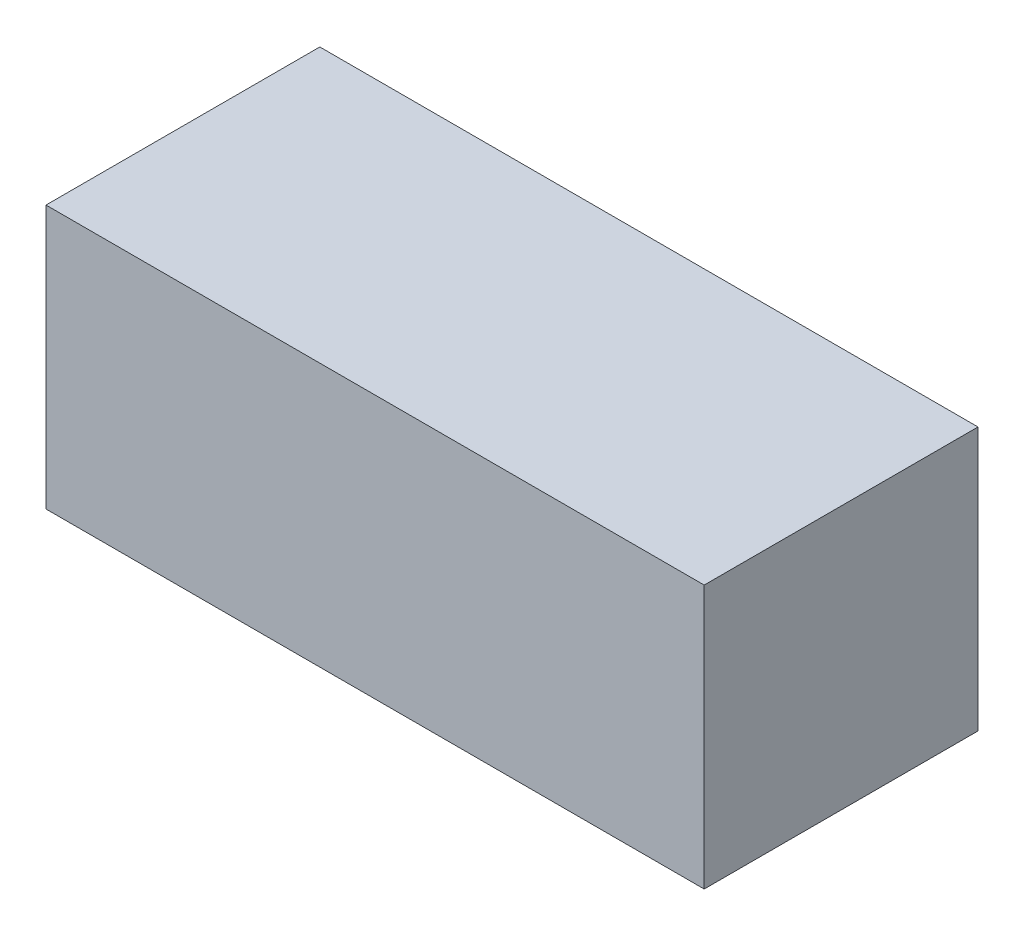
ISO-10303-21;
HEADER;
FILE_DESCRIPTION(('STEP AP214'),'2;1');
FILE_NAME('part.step','',(''),(''),'','','');
FILE_SCHEMA(('AUTOMOTIVE_DESIGN { 1 0 10303 214 1 1 1 1 }'));
ENDSEC;
DATA;
#1=APPLICATION_CONTEXT('core data for automotive mechanical design processes');
#2=APPLICATION_PROTOCOL_DEFINITION('international standard','automotive_design',2000,#1);
#3=PRODUCT_CONTEXT('',#1,'mechanical');
#4=PRODUCT('Part','Part','',(#3));
#5=PRODUCT_RELATED_PRODUCT_CATEGORY('part','',(#4));
#6=PRODUCT_DEFINITION_FORMATION('','',#4);
#7=PRODUCT_DEFINITION_CONTEXT('part definition',#1,'design');
#8=PRODUCT_DEFINITION('design','',#6,#7);
#9=PRODUCT_DEFINITION_SHAPE('','',#8);
#10=(LENGTH_UNIT() NAMED_UNIT(*) SI_UNIT(.MILLI.,.METRE.));
#11=(NAMED_UNIT(*) PLANE_ANGLE_UNIT() SI_UNIT($,.RADIAN.));
#12=(NAMED_UNIT(*) SI_UNIT($,.STERADIAN.) SOLID_ANGLE_UNIT());
#13=UNCERTAINTY_MEASURE_WITH_UNIT(LENGTH_MEASURE(1.E-05),#10,'distance_accuracy_value','');
#14=(GEOMETRIC_REPRESENTATION_CONTEXT(3) GLOBAL_UNCERTAINTY_ASSIGNED_CONTEXT((#13)) GLOBAL_UNIT_ASSIGNED_CONTEXT((#10,
#11,#12)) REPRESENTATION_CONTEXT('',''));
#15=CARTESIAN_POINT('',(0.,0.,0.));
#16=DIRECTION('',(0.,0.,1.));
#17=DIRECTION('',(1.,0.,0.));
#18=AXIS2_PLACEMENT_3D('',#15,#16,#17);
#19=CARTESIAN_POINT('',(0.,0.,-400.));
#20=DIRECTION('',(-1.,0.,0.));
#21=DIRECTION('',(0.,0.,1.));
#22=AXIS2_PLACEMENT_3D('',#19,#20,#21);
#23=PLANE('',#22);
#24=DIRECTION('',(0.,0.,1.));
#25=VECTOR('',#24,1.);
#26=CARTESIAN_POINT('',(0.,0.,-400.));
#27=LINE('',#26,#25);
#28=CARTESIAN_POINT('',(0.,0.,-400.));
#29=VERTEX_POINT('',#28);
#30=CARTESIAN_POINT('',(0.,0.,16.));
#31=VERTEX_POINT('',#30);
#32=EDGE_CURVE('E11',#29,#31,#27,.T.);
#33=ORIENTED_EDGE('',*,*,#32,.T.);
#34=DIRECTION('',(0.,-1.,0.));
#35=VECTOR('',#34,1.);
#36=CARTESIAN_POINT('',(0.,400.,16.));
#37=LINE('',#36,#35);
#38=CARTESIAN_POINT('',(0.,400.,16.));
#39=VERTEX_POINT('',#38);
#40=EDGE_CURVE('E149',#39,#31,#37,.T.);
#41=ORIENTED_EDGE('',*,*,#40,.F.);
#42=DIRECTION('',(0.,0.,1.));
#43=VECTOR('',#42,1.);
#44=CARTESIAN_POINT('',(0.,400.,-400.));
#45=LINE('',#44,#43);
#46=CARTESIAN_POINT('',(0.,400.,-400.));
#47=VERTEX_POINT('',#46);
#48=EDGE_CURVE('E43',#47,#39,#45,.T.);
#49=ORIENTED_EDGE('',*,*,#48,.F.);
#50=DIRECTION('',(0.,-1.,0.));
#51=VECTOR('',#50,1.);
#52=CARTESIAN_POINT('',(0.,0.,-400.));
#53=LINE('',#52,#51);
#54=EDGE_CURVE('E117',#47,#29,#53,.T.);
#55=ORIENTED_EDGE('',*,*,#54,.T.);
#56=EDGE_LOOP('',(#33,#41,#49,#55));
#57=FACE_BOUND('',#56,.T.);
#58=ADVANCED_FACE('F33',(#57),#23,.T.);
#59=CARTESIAN_POINT('',(0.,400.,-400.));
#60=DIRECTION('',(0.,1.,0.));
#61=DIRECTION('',(0.,0.,1.));
#62=AXIS2_PLACEMENT_3D('',#59,#60,#61);
#63=PLANE('',#62);
#64=ORIENTED_EDGE('',*,*,#48,.T.);
#65=DIRECTION('',(-1.,0.,0.));
#66=VECTOR('',#65,1.);
#67=CARTESIAN_POINT('',(0.,400.,16.));
#68=LINE('',#67,#66);
#69=CARTESIAN_POINT('',(1000.,400.,16.));
#70=VERTEX_POINT('',#69);
#71=EDGE_CURVE('E103',#70,#39,#68,.T.);
#72=ORIENTED_EDGE('',*,*,#71,.F.);
#73=DIRECTION('',(0.,0.,1.));
#74=VECTOR('',#73,1.);
#75=CARTESIAN_POINT('',(1000.,400.,-400.));
#76=LINE('',#75,#74);
#77=CARTESIAN_POINT('',(1000.,400.,-400.));
#78=VERTEX_POINT('',#77);
#79=EDGE_CURVE('E95',#78,#70,#76,.T.);
#80=ORIENTED_EDGE('',*,*,#79,.F.);
#81=DIRECTION('',(-1.,0.,0.));
#82=VECTOR('',#81,1.);
#83=CARTESIAN_POINT('',(0.,400.,-400.));
#84=LINE('',#83,#82);
#85=EDGE_CURVE('E99',#78,#47,#84,.T.);
#86=ORIENTED_EDGE('',*,*,#85,.T.);
#87=EDGE_LOOP('',(#64,#72,#80,#86));
#88=FACE_BOUND('',#87,.T.);
#89=ADVANCED_FACE('F98',(#88),#63,.T.);
#90=CARTESIAN_POINT('',(1000.,400.,-400.));
#91=DIRECTION('',(1.,0.,0.));
#92=DIRECTION('',(0.,0.,-1.));
#93=AXIS2_PLACEMENT_3D('',#90,#91,#92);
#94=PLANE('',#93);
#95=ORIENTED_EDGE('',*,*,#79,.T.);
#96=DIRECTION('',(0.,1.,0.));
#97=VECTOR('',#96,1.);
#98=CARTESIAN_POINT('',(1000.,400.,16.));
#99=LINE('',#98,#97);
#100=CARTESIAN_POINT('',(1000.,0.,16.));
#101=VERTEX_POINT('',#100);
#102=EDGE_CURVE('E236',#101,#70,#99,.T.);
#103=ORIENTED_EDGE('',*,*,#102,.F.);
#104=DIRECTION('',(0.,0.,1.));
#105=VECTOR('',#104,1.);
#106=CARTESIAN_POINT('',(1000.,0.,-400.));
#107=LINE('',#106,#105);
#108=CARTESIAN_POINT('',(1000.,0.,-400.));
#109=VERTEX_POINT('',#108);
#110=EDGE_CURVE('E108',#109,#101,#107,.T.);
#111=ORIENTED_EDGE('',*,*,#110,.F.);
#112=DIRECTION('',(0.,1.,0.));
#113=VECTOR('',#112,1.);
#114=CARTESIAN_POINT('',(1000.,400.,-400.));
#115=LINE('',#114,#113);
#116=EDGE_CURVE('E114',#109,#78,#115,.T.);
#117=ORIENTED_EDGE('',*,*,#116,.T.);
#118=EDGE_LOOP('',(#95,#103,#111,#117));
#119=FACE_BOUND('',#118,.T.);
#120=ADVANCED_FACE('F119',(#119),#94,.T.);
#121=CARTESIAN_POINT('',(1000.,0.,-400.));
#122=DIRECTION('',(0.,-1.,0.));
#123=DIRECTION('',(1.,0.,0.));
#124=AXIS2_PLACEMENT_3D('',#121,#122,#123);
#125=PLANE('',#124);
#126=ORIENTED_EDGE('',*,*,#110,.T.);
#127=DIRECTION('',(1.,0.,0.));
#128=VECTOR('',#127,1.);
#129=CARTESIAN_POINT('',(0.,0.,16.));
#130=LINE('',#129,#128);
#131=EDGE_CURVE('E152',#31,#101,#130,.T.);
#132=ORIENTED_EDGE('',*,*,#131,.F.);
#133=ORIENTED_EDGE('',*,*,#32,.F.);
#134=DIRECTION('',(1.,0.,0.));
#135=VECTOR('',#134,1.);
#136=CARTESIAN_POINT('',(0.,0.,-400.));
#137=LINE('',#136,#135);
#138=CARTESIAN_POINT('',(16.,0.,-400.));
#139=VERTEX_POINT('',#138);
#140=EDGE_CURVE('E136',#29,#139,#137,.T.);
#141=ORIENTED_EDGE('',*,*,#140,.T.);
#142=DIRECTION('',(0.,0.,1.));
#143=VECTOR('',#142,1.);
#144=CARTESIAN_POINT('',(16.,0.,-400.));
#145=LINE('',#144,#143);
#146=CARTESIAN_POINT('',(16.,0.,0.));
#147=VERTEX_POINT('',#146);
#148=EDGE_CURVE('E37',#139,#147,#145,.T.);
#149=ORIENTED_EDGE('',*,*,#148,.T.);
#150=DIRECTION('',(1.,0.,0.));
#151=VECTOR('',#150,1.);
#152=CARTESIAN_POINT('',(0.,0.,0.));
#153=LINE('',#152,#151);
#154=CARTESIAN_POINT('',(984.,0.,0.));
#155=VERTEX_POINT('',#154);
#156=EDGE_CURVE('E146',#147,#155,#153,.T.);
#157=ORIENTED_EDGE('',*,*,#156,.T.);
#158=DIRECTION('',(0.,0.,1.));
#159=VECTOR('',#158,1.);
#160=CARTESIAN_POINT('',(984.,0.,-400.));
#161=LINE('',#160,#159);
#162=CARTESIAN_POINT('',(984.,0.,-400.));
#163=VERTEX_POINT('',#162);
#164=EDGE_CURVE('E140',#163,#155,#161,.T.);
#165=ORIENTED_EDGE('',*,*,#164,.F.);
#166=DIRECTION('',(1.,0.,0.));
#167=VECTOR('',#166,1.);
#168=CARTESIAN_POINT('',(1000.,0.,-400.));
#169=LINE('',#168,#167);
#170=EDGE_CURVE('E121',#163,#109,#169,.T.);
#171=ORIENTED_EDGE('',*,*,#170,.T.);
#172=EDGE_LOOP('',(#126,#132,#133,#141,#149,#157,#165,#171));
#173=FACE_BOUND('',#172,.T.);
#174=ADVANCED_FACE('F144',(#173),#125,.T.);
#175=CARTESIAN_POINT('',(984.,384.,-400.));
#176=DIRECTION('',(-1.,0.,0.));
#177=DIRECTION('',(0.,0.,1.));
#178=AXIS2_PLACEMENT_3D('',#175,#176,#177);
#179=PLANE('',#178);
#180=DIRECTION('',(0.,-1.,0.));
#181=VECTOR('',#180,1.);
#182=CARTESIAN_POINT('',(984.,384.,0.));
#183=LINE('',#182,#181);
#184=CARTESIAN_POINT('',(984.,384.,0.));
#185=VERTEX_POINT('',#184);
#186=EDGE_CURVE('E134',#185,#155,#183,.T.);
#187=ORIENTED_EDGE('',*,*,#186,.F.);
#188=DIRECTION('',(0.,0.,1.));
#189=VECTOR('',#188,1.);
#190=CARTESIAN_POINT('',(984.,384.,-400.));
#191=LINE('',#190,#189);
#192=CARTESIAN_POINT('',(984.,384.,-400.));
#193=VERTEX_POINT('',#192);
#194=EDGE_CURVE('E73',#193,#185,#191,.T.);
#195=ORIENTED_EDGE('',*,*,#194,.F.);
#196=DIRECTION('',(0.,-1.,0.));
#197=VECTOR('',#196,1.);
#198=CARTESIAN_POINT('',(984.,384.,-400.));
#199=LINE('',#198,#197);
#200=EDGE_CURVE('E123',#193,#163,#199,.T.);
#201=ORIENTED_EDGE('',*,*,#200,.T.);
#202=ORIENTED_EDGE('',*,*,#164,.T.);
#203=EDGE_LOOP('',(#187,#195,#201,#202));
#204=FACE_BOUND('',#203,.T.);
#205=ADVANCED_FACE('F164',(#204),#179,.T.);
#206=CARTESIAN_POINT('',(16.,384.,-400.));
#207=DIRECTION('',(0.,-1.,0.));
#208=DIRECTION('',(0.,0.,-1.));
#209=AXIS2_PLACEMENT_3D('',#206,#207,#208);
#210=PLANE('',#209);
#211=DIRECTION('',(1.,0.,0.));
#212=VECTOR('',#211,1.);
#213=CARTESIAN_POINT('',(16.,384.,0.));
#214=LINE('',#213,#212);
#215=CARTESIAN_POINT('',(16.,384.,0.));
#216=VERTEX_POINT('',#215);
#217=EDGE_CURVE('E131',#216,#185,#214,.T.);
#218=ORIENTED_EDGE('',*,*,#217,.F.);
#219=DIRECTION('',(0.,0.,1.));
#220=VECTOR('',#219,1.);
#221=CARTESIAN_POINT('',(16.,384.,-400.));
#222=LINE('',#221,#220);
#223=CARTESIAN_POINT('',(16.,384.,-400.));
#224=VERTEX_POINT('',#223);
#225=EDGE_CURVE('E66',#224,#216,#222,.T.);
#226=ORIENTED_EDGE('',*,*,#225,.F.);
#227=DIRECTION('',(1.,0.,0.));
#228=VECTOR('',#227,1.);
#229=CARTESIAN_POINT('',(16.,384.,-400.));
#230=LINE('',#229,#228);
#231=EDGE_CURVE('E160',#224,#193,#230,.T.);
#232=ORIENTED_EDGE('',*,*,#231,.T.);
#233=ORIENTED_EDGE('',*,*,#194,.T.);
#234=EDGE_LOOP('',(#218,#226,#232,#233));
#235=FACE_BOUND('',#234,.T.);
#236=ADVANCED_FACE('F166',(#235),#210,.T.);
#237=CARTESIAN_POINT('',(16.,0.,-400.));
#238=DIRECTION('',(1.,0.,0.));
#239=DIRECTION('',(0.,0.,-1.));
#240=AXIS2_PLACEMENT_3D('',#237,#238,#239);
#241=PLANE('',#240);
#242=DIRECTION('',(0.,1.,0.));
#243=VECTOR('',#242,1.);
#244=CARTESIAN_POINT('',(16.,0.,0.));
#245=LINE('',#244,#243);
#246=EDGE_CURVE('E128',#147,#216,#245,.T.);
#247=ORIENTED_EDGE('',*,*,#246,.F.);
#248=ORIENTED_EDGE('',*,*,#148,.F.);
#249=DIRECTION('',(0.,1.,0.));
#250=VECTOR('',#249,1.);
#251=CARTESIAN_POINT('',(16.,0.,-400.));
#252=LINE('',#251,#250);
#253=EDGE_CURVE('E158',#139,#224,#252,.T.);
#254=ORIENTED_EDGE('',*,*,#253,.T.);
#255=ORIENTED_EDGE('',*,*,#225,.T.);
#256=EDGE_LOOP('',(#247,#248,#254,#255));
#257=FACE_BOUND('',#256,.T.);
#258=ADVANCED_FACE('F35',(#257),#241,.T.);
#259=CARTESIAN_POINT('',(0.,0.,-400.));
#260=DIRECTION('',(0.,0.,1.));
#261=DIRECTION('',(1.,0.,0.));
#262=AXIS2_PLACEMENT_3D('',#259,#260,#261);
#263=PLANE('',#262);
#264=ORIENTED_EDGE('',*,*,#140,.F.);
#265=ORIENTED_EDGE('',*,*,#54,.F.);
#266=ORIENTED_EDGE('',*,*,#85,.F.);
#267=ORIENTED_EDGE('',*,*,#116,.F.);
#268=ORIENTED_EDGE('',*,*,#170,.F.);
#269=ORIENTED_EDGE('',*,*,#200,.F.);
#270=ORIENTED_EDGE('',*,*,#231,.F.);
#271=ORIENTED_EDGE('',*,*,#253,.F.);
#272=EDGE_LOOP('',(#264,#265,#266,#267,#268,#269,#270,#271));
#273=FACE_BOUND('',#272,.T.);
#274=ADVANCED_FACE('F112',(#273),#263,.F.);
#275=CARTESIAN_POINT('',(0.,0.,0.));
#276=DIRECTION('',(0.,0.,1.));
#277=DIRECTION('',(1.,0.,0.));
#278=AXIS2_PLACEMENT_3D('',#275,#276,#277);
#279=PLANE('',#278);
#280=ORIENTED_EDGE('',*,*,#156,.F.);
#281=ORIENTED_EDGE('',*,*,#246,.T.);
#282=ORIENTED_EDGE('',*,*,#217,.T.);
#283=ORIENTED_EDGE('',*,*,#186,.T.);
#284=EDGE_LOOP('',(#280,#281,#282,#283));
#285=FACE_BOUND('',#284,.T.);
#286=ADVANCED_FACE('F148',(#285),#279,.F.);
#287=CARTESIAN_POINT('',(0.,0.,16.));
#288=DIRECTION('',(0.,0.,1.));
#289=DIRECTION('',(1.,0.,0.));
#290=AXIS2_PLACEMENT_3D('',#287,#288,#289);
#291=PLANE('',#290);
#292=ORIENTED_EDGE('',*,*,#40,.T.);
#293=ORIENTED_EDGE('',*,*,#131,.T.);
#294=ORIENTED_EDGE('',*,*,#102,.T.);
#295=ORIENTED_EDGE('',*,*,#71,.T.);
#296=EDGE_LOOP('',(#292,#293,#294,#295));
#297=FACE_BOUND('',#296,.T.);
#298=ADVANCED_FACE('F216',(#297),#291,.T.);
#299=CLOSED_SHELL('',(#58,#89,#120,#174,#205,#236,#258,#274,#286,#298));
#300=MANIFOLD_SOLID_BREP('B2',#299);
#301=ADVANCED_BREP_SHAPE_REPRESENTATION('',(#18,#300),#14);
#302=SHAPE_DEFINITION_REPRESENTATION(#9,#301);
ENDSEC;
END-ISO-10303-21;
